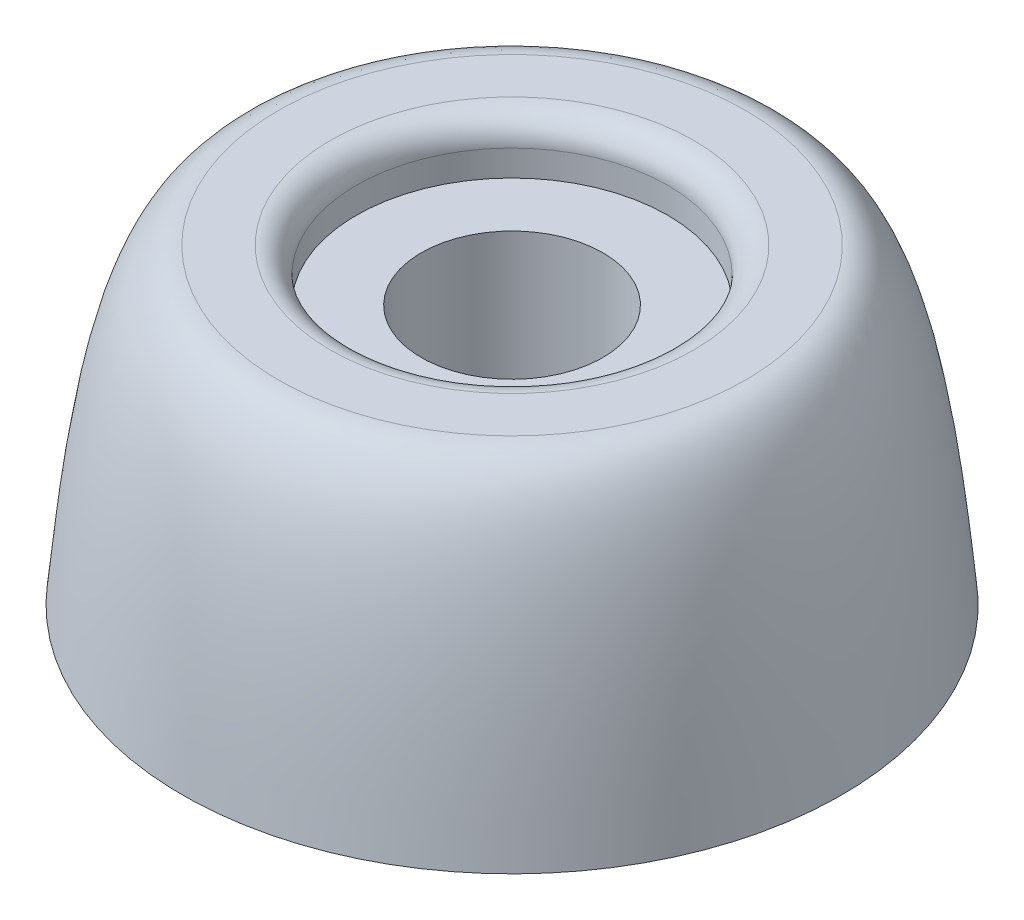
ISO-10303-21;
HEADER;
FILE_DESCRIPTION(('STEP AP214'),'2;1');
FILE_NAME('part.step','',(''),(''),'','','');
FILE_SCHEMA(('AUTOMOTIVE_DESIGN { 1 0 10303 214 1 1 1 1 }'));
ENDSEC;
DATA;
#1=APPLICATION_CONTEXT('core data for automotive mechanical design processes');
#2=APPLICATION_PROTOCOL_DEFINITION('international standard','automotive_design',2000,#1);
#3=PRODUCT_CONTEXT('',#1,'mechanical');
#4=PRODUCT('Part','Part','',(#3));
#5=PRODUCT_RELATED_PRODUCT_CATEGORY('part','',(#4));
#6=PRODUCT_DEFINITION_FORMATION('','',#4);
#7=PRODUCT_DEFINITION_CONTEXT('part definition',#1,'design');
#8=PRODUCT_DEFINITION('design','',#6,#7);
#9=PRODUCT_DEFINITION_SHAPE('','',#8);
#10=(LENGTH_UNIT() NAMED_UNIT(*) SI_UNIT(.MILLI.,.METRE.));
#11=(NAMED_UNIT(*) PLANE_ANGLE_UNIT() SI_UNIT($,.RADIAN.));
#12=(NAMED_UNIT(*) SI_UNIT($,.STERADIAN.) SOLID_ANGLE_UNIT());
#13=UNCERTAINTY_MEASURE_WITH_UNIT(LENGTH_MEASURE(1.E-05),#10,'distance_accuracy_value','');
#14=(GEOMETRIC_REPRESENTATION_CONTEXT(3) GLOBAL_UNCERTAINTY_ASSIGNED_CONTEXT((#13)) GLOBAL_UNIT_ASSIGNED_CONTEXT((#10,
#11,#12)) REPRESENTATION_CONTEXT('',''));
#15=CARTESIAN_POINT('',(0.,0.,0.));
#16=DIRECTION('',(0.,0.,1.));
#17=DIRECTION('',(1.,0.,0.));
#18=AXIS2_PLACEMENT_3D('',#15,#16,#17);
#19=CARTESIAN_POINT('',(0.,12.,0.));
#20=DIRECTION('',(0.,-1.,0.));
#21=DIRECTION('',(0.,0.,-1.));
#22=AXIS2_PLACEMENT_3D('',#19,#20,#21);
#23=PLANE('',#22);
#24=CARTESIAN_POINT('',(0.,12.,0.));
#25=DIRECTION('',(0.,-1.,0.));
#26=DIRECTION('',(0.,0.,-1.));
#27=AXIS2_PLACEMENT_3D('',#24,#25,#26);
#28=CIRCLE('',#27,7.);
#29=CARTESIAN_POINT('',(0.,12.,-7.));
#30=VERTEX_POINT('',#29);
#31=EDGE_CURVE('E45',#30,#30,#28,.T.);
#32=ORIENTED_EDGE('',*,*,#31,.T.);
#33=EDGE_LOOP('',(#32));
#34=FACE_BOUND('',#33,.T.);
#35=CARTESIAN_POINT('',(0.,12.,0.));
#36=DIRECTION('',(0.,-1.,0.));
#37=DIRECTION('',(0.,0.,-1.));
#38=AXIS2_PLACEMENT_3D('',#35,#36,#37);
#39=CIRCLE('',#38,9.);
#40=CARTESIAN_POINT('',(0.,12.,-9.));
#41=VERTEX_POINT('',#40);
#42=EDGE_CURVE('E50',#41,#41,#39,.T.);
#43=ORIENTED_EDGE('',*,*,#42,.F.);
#44=EDGE_LOOP('',(#43));
#45=FACE_BOUND('',#44,.T.);
#46=ADVANCED_FACE('F37',(#34,#45),#23,.F.);
#47=CARTESIAN_POINT('',(-9.,12.,0.));
#48=CARTESIAN_POINT('',(-11.6199777912741,11.9725301269229,0.));
#49=CARTESIAN_POINT('',(-12.2944908534584,4.05777741604348,0.));
#50=CARTESIAN_POINT('',(-12.7,0.,0.));
#51=B_SPLINE_CURVE_WITH_KNOTS('',3,(#47,#48,#49,#50),.UNSPECIFIED.,.F.,.F.,(4,4),(0.,1.),.UNSPECIFIED.);
#52=CARTESIAN_POINT('',(0.,0.,0.));
#53=DIRECTION('',(0.,-1.,0.));
#54=AXIS1_PLACEMENT('',#52,#53);
#55=SURFACE_OF_REVOLUTION('',#51,#54);
#56=CARTESIAN_POINT('',(0.,0.,0.));
#57=DIRECTION('',(0.,-1.,0.));
#58=DIRECTION('',(0.,0.,-1.));
#59=AXIS2_PLACEMENT_3D('',#56,#57,#58);
#60=CIRCLE('',#59,12.7);
#61=CARTESIAN_POINT('',(0.,0.,-12.7));
#62=VERTEX_POINT('',#61);
#63=EDGE_CURVE('E55',#62,#62,#60,.T.);
#64=ORIENTED_EDGE('',*,*,#63,.F.);
#65=EDGE_LOOP('',(#64));
#66=FACE_BOUND('',#65,.T.);
#67=ORIENTED_EDGE('',*,*,#42,.T.);
#68=EDGE_LOOP('',(#67));
#69=FACE_BOUND('',#68,.T.);
#70=ADVANCED_FACE('F80',(#66,#69),#55,.T.);
#71=CARTESIAN_POINT('',(0.,0.,0.));
#72=DIRECTION('',(0.,1.,0.));
#73=DIRECTION('',(0.,0.,1.));
#74=AXIS2_PLACEMENT_3D('',#71,#72,#73);
#75=PLANE('',#74);
#76=CARTESIAN_POINT('',(0.,0.,0.));
#77=DIRECTION('',(0.,-1.,0.));
#78=DIRECTION('',(0.,0.,-1.));
#79=AXIS2_PLACEMENT_3D('',#76,#77,#78);
#80=CIRCLE('',#79,3.5);
#81=CARTESIAN_POINT('',(0.,0.,-3.5));
#82=VERTEX_POINT('',#81);
#83=EDGE_CURVE('E61',#82,#82,#80,.T.);
#84=ORIENTED_EDGE('',*,*,#83,.F.);
#85=EDGE_LOOP('',(#84));
#86=FACE_BOUND('',#85,.T.);
#87=ORIENTED_EDGE('',*,*,#63,.T.);
#88=EDGE_LOOP('',(#87));
#89=FACE_BOUND('',#88,.T.);
#90=ADVANCED_FACE('F83',(#86,#89),#75,.F.);
#91=CARTESIAN_POINT('',(0.,0.,0.));
#92=DIRECTION('',(0.,-1.,0.));
#93=DIRECTION('',(0.,0.,-1.));
#94=AXIS2_PLACEMENT_3D('',#91,#92,#93);
#95=CYLINDRICAL_SURFACE('',#94,3.5);
#96=ORIENTED_EDGE('',*,*,#83,.T.);
#97=EDGE_LOOP('',(#96));
#98=FACE_BOUND('',#97,.T.);
#99=CARTESIAN_POINT('',(0.,10.,0.));
#100=DIRECTION('',(0.,-1.,0.));
#101=DIRECTION('',(0.,0.,-1.));
#102=AXIS2_PLACEMENT_3D('',#99,#100,#101);
#103=CIRCLE('',#102,3.5);
#104=CARTESIAN_POINT('',(0.,10.,-3.5));
#105=VERTEX_POINT('',#104);
#106=EDGE_CURVE('E65',#105,#105,#103,.T.);
#107=ORIENTED_EDGE('',*,*,#106,.F.);
#108=EDGE_LOOP('',(#107));
#109=FACE_BOUND('',#108,.T.);
#110=ADVANCED_FACE('F104',(#98,#109),#95,.F.);
#111=CARTESIAN_POINT('',(0.,10.,0.));
#112=DIRECTION('',(0.,-1.,0.));
#113=DIRECTION('',(0.,0.,-1.));
#114=AXIS2_PLACEMENT_3D('',#111,#112,#113);
#115=PLANE('',#114);
#116=CARTESIAN_POINT('',(0.,10.,0.));
#117=DIRECTION('',(0.,-1.,0.));
#118=DIRECTION('',(0.,0.,-1.));
#119=AXIS2_PLACEMENT_3D('',#116,#117,#118);
#120=CIRCLE('',#119,6.);
#121=CARTESIAN_POINT('',(0.,10.,-6.));
#122=VERTEX_POINT('',#121);
#123=EDGE_CURVE('E69',#122,#122,#120,.T.);
#124=ORIENTED_EDGE('',*,*,#123,.F.);
#125=EDGE_LOOP('',(#124));
#126=FACE_BOUND('',#125,.T.);
#127=ORIENTED_EDGE('',*,*,#106,.T.);
#128=EDGE_LOOP('',(#127));
#129=FACE_BOUND('',#128,.T.);
#130=ADVANCED_FACE('F111',(#126,#129),#115,.F.);
#131=CARTESIAN_POINT('',(0.,0.,0.));
#132=DIRECTION('',(0.,-1.,0.));
#133=DIRECTION('',(0.,0.,-1.));
#134=AXIS2_PLACEMENT_3D('',#131,#132,#133);
#135=CYLINDRICAL_SURFACE('',#134,6.);
#136=CARTESIAN_POINT('',(0.,11.,0.));
#137=DIRECTION('',(0.,-1.,0.));
#138=DIRECTION('',(0.,0.,-1.));
#139=AXIS2_PLACEMENT_3D('',#136,#137,#138);
#140=CIRCLE('',#139,6.);
#141=CARTESIAN_POINT('',(0.,11.,-6.));
#142=VERTEX_POINT('',#141);
#143=EDGE_CURVE('E10',#142,#142,#140,.F.);
#144=ORIENTED_EDGE('',*,*,#143,.T.);
#145=EDGE_LOOP('',(#144));
#146=FACE_BOUND('',#145,.T.);
#147=ORIENTED_EDGE('',*,*,#123,.T.);
#148=EDGE_LOOP('',(#147));
#149=FACE_BOUND('',#148,.T.);
#150=ADVANCED_FACE('F117',(#146,#149),#135,.F.);
#151=CARTESIAN_POINT('',(0.,11.,0.));
#152=DIRECTION('',(0.,-1.,0.));
#153=DIRECTION('',(0.,0.,-1.));
#154=AXIS2_PLACEMENT_3D('',#151,#152,#153);
#155=TOROIDAL_SURFACE('',#154,7.,1.);
#156=ORIENTED_EDGE('',*,*,#143,.F.);
#157=EDGE_LOOP('',(#156));
#158=FACE_BOUND('',#157,.T.);
#159=ORIENTED_EDGE('',*,*,#31,.F.);
#160=EDGE_LOOP('',(#159));
#161=FACE_BOUND('',#160,.T.);
#162=ADVANCED_FACE('F39',(#158,#161),#155,.T.);
#163=CLOSED_SHELL('',(#46,#70,#90,#110,#130,#150,#162));
#164=MANIFOLD_SOLID_BREP('B2',#163);
#165=ADVANCED_BREP_SHAPE_REPRESENTATION('',(#18,#164),#14);
#166=SHAPE_DEFINITION_REPRESENTATION(#9,#165);
ENDSEC;
END-ISO-10303-21;
